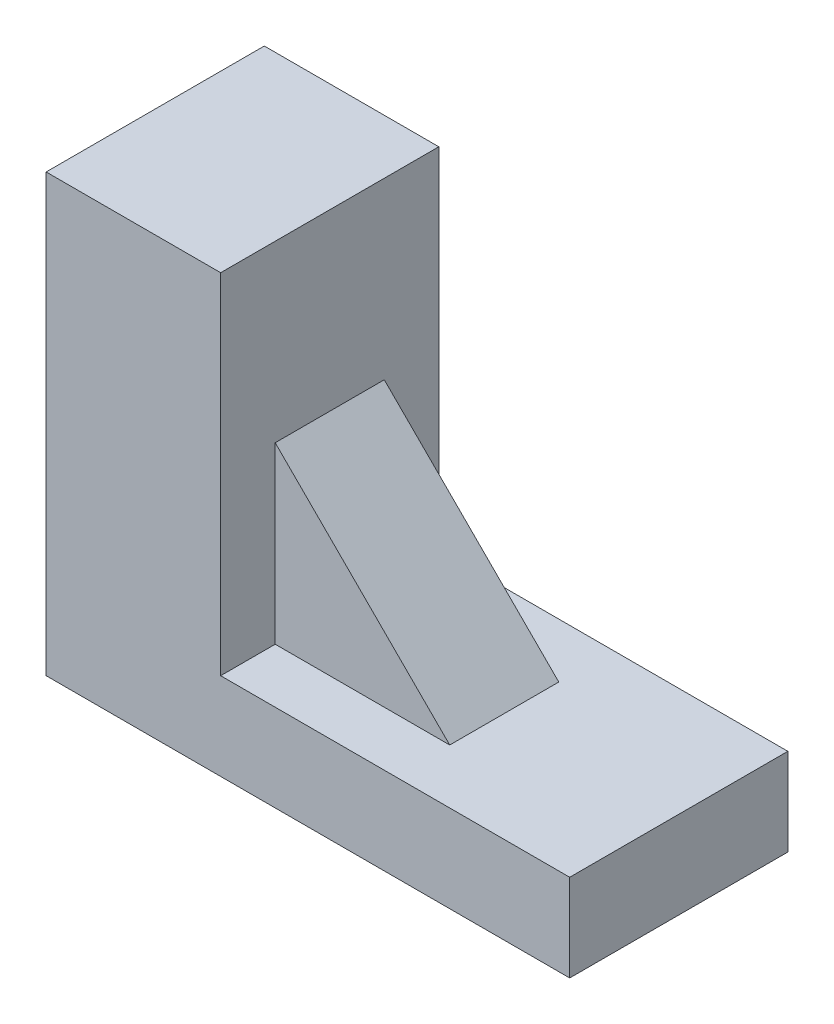
ISO-10303-21;
HEADER;
FILE_DESCRIPTION(('STEP AP214'),'2;1');
FILE_NAME('part.step','',(''),(''),'','','');
FILE_SCHEMA(('AUTOMOTIVE_DESIGN { 1 0 10303 214 1 1 1 1 }'));
ENDSEC;
DATA;
#1=APPLICATION_CONTEXT('core data for automotive mechanical design processes');
#2=APPLICATION_PROTOCOL_DEFINITION('international standard','automotive_design',2000,#1);
#3=PRODUCT_CONTEXT('',#1,'mechanical');
#4=PRODUCT('Part','Part','',(#3));
#5=PRODUCT_RELATED_PRODUCT_CATEGORY('part','',(#4));
#6=PRODUCT_DEFINITION_FORMATION('','',#4);
#7=PRODUCT_DEFINITION_CONTEXT('part definition',#1,'design');
#8=PRODUCT_DEFINITION('design','',#6,#7);
#9=PRODUCT_DEFINITION_SHAPE('','',#8);
#10=(LENGTH_UNIT() NAMED_UNIT(*) SI_UNIT(.MILLI.,.METRE.));
#11=(NAMED_UNIT(*) PLANE_ANGLE_UNIT() SI_UNIT($,.RADIAN.));
#12=(NAMED_UNIT(*) SI_UNIT($,.STERADIAN.) SOLID_ANGLE_UNIT());
#13=UNCERTAINTY_MEASURE_WITH_UNIT(LENGTH_MEASURE(1.E-05),#10,'distance_accuracy_value','');
#14=(GEOMETRIC_REPRESENTATION_CONTEXT(3) GLOBAL_UNCERTAINTY_ASSIGNED_CONTEXT((#13)) GLOBAL_UNIT_ASSIGNED_CONTEXT((#10,
#11,#12)) REPRESENTATION_CONTEXT('',''));
#15=CARTESIAN_POINT('',(0.,0.,0.));
#16=DIRECTION('',(0.,0.,1.));
#17=DIRECTION('',(1.,0.,0.));
#18=AXIS2_PLACEMENT_3D('',#15,#16,#17);
#19=CARTESIAN_POINT('',(8.,0.,-10.));
#20=DIRECTION('',(0.,1.,0.));
#21=DIRECTION('',(-1.,0.,0.));
#22=AXIS2_PLACEMENT_3D('',#19,#20,#21);
#23=PLANE('',#22);
#24=DIRECTION('',(-1.,0.,0.));
#25=VECTOR('',#24,1.);
#26=CARTESIAN_POINT('',(8.,0.,0.));
#27=LINE('',#26,#25);
#28=CARTESIAN_POINT('',(8.,0.,0.));
#29=VERTEX_POINT('',#28);
#30=CARTESIAN_POINT('',(0.,0.,0.));
#31=VERTEX_POINT('',#30);
#32=EDGE_CURVE('E149',#29,#31,#27,.T.);
#33=ORIENTED_EDGE('',*,*,#32,.F.);
#34=DIRECTION('',(0.,0.,1.));
#35=VECTOR('',#34,1.);
#36=CARTESIAN_POINT('',(8.,0.,-10.));
#37=LINE('',#36,#35);
#38=CARTESIAN_POINT('',(8.,0.,-10.));
#39=VERTEX_POINT('',#38);
#40=EDGE_CURVE('E11',#39,#29,#37,.T.);
#41=ORIENTED_EDGE('',*,*,#40,.F.);
#42=DIRECTION('',(-1.,0.,0.));
#43=VECTOR('',#42,1.);
#44=CARTESIAN_POINT('',(8.,0.,-10.));
#45=LINE('',#44,#43);
#46=CARTESIAN_POINT('',(0.,0.,-10.));
#47=VERTEX_POINT('',#46);
#48=EDGE_CURVE('E170',#39,#47,#45,.T.);
#49=ORIENTED_EDGE('',*,*,#48,.T.);
#50=DIRECTION('',(0.,0.,1.));
#51=VECTOR('',#50,1.);
#52=CARTESIAN_POINT('',(0.,0.,-10.));
#53=LINE('',#52,#51);
#54=EDGE_CURVE('E46',#47,#31,#53,.T.);
#55=ORIENTED_EDGE('',*,*,#54,.T.);
#56=EDGE_LOOP('',(#33,#41,#49,#55));
#57=FACE_BOUND('',#56,.T.);
#58=ADVANCED_FACE('F43',(#57),#23,.T.);
#59=CARTESIAN_POINT('',(8.,-16.,-10.));
#60=DIRECTION('',(1.,0.,0.));
#61=DIRECTION('',(0.,0.,-1.));
#62=AXIS2_PLACEMENT_3D('',#59,#60,#61);
#63=PLANE('',#62);
#64=DIRECTION('',(0.,-1.,0.));
#65=VECTOR('',#64,1.);
#66=CARTESIAN_POINT('',(8.,-16.,-2.5));
#67=LINE('',#66,#65);
#68=CARTESIAN_POINT('',(8.,-8.,-2.5));
#69=VERTEX_POINT('',#68);
#70=CARTESIAN_POINT('',(8.,-16.,-2.5));
#71=VERTEX_POINT('',#70);
#72=EDGE_CURVE('E188',#69,#71,#67,.T.);
#73=ORIENTED_EDGE('',*,*,#72,.F.);
#74=DIRECTION('',(0.,0.,-1.));
#75=VECTOR('',#74,1.);
#76=CARTESIAN_POINT('',(8.,-8.,-10.));
#77=LINE('',#76,#75);
#78=CARTESIAN_POINT('',(8.,-8.,-7.5));
#79=VERTEX_POINT('',#78);
#80=EDGE_CURVE('E154',#79,#69,#77,.F.);
#81=ORIENTED_EDGE('',*,*,#80,.F.);
#82=DIRECTION('',(0.,-1.,0.));
#83=VECTOR('',#82,1.);
#84=CARTESIAN_POINT('',(8.,-16.,-7.5));
#85=LINE('',#84,#83);
#86=CARTESIAN_POINT('',(8.,-16.,-7.5));
#87=VERTEX_POINT('',#86);
#88=EDGE_CURVE('E200',#79,#87,#85,.T.);
#89=ORIENTED_EDGE('',*,*,#88,.T.);
#90=DIRECTION('',(0.,0.,1.));
#91=VECTOR('',#90,1.);
#92=CARTESIAN_POINT('',(8.,-16.,-10.));
#93=LINE('',#92,#91);
#94=CARTESIAN_POINT('',(8.,-16.,-10.));
#95=VERTEX_POINT('',#94);
#96=EDGE_CURVE('E52',#95,#87,#93,.T.);
#97=ORIENTED_EDGE('',*,*,#96,.F.);
#98=DIRECTION('',(0.,1.,0.));
#99=VECTOR('',#98,1.);
#100=CARTESIAN_POINT('',(8.,-16.,-10.));
#101=LINE('',#100,#99);
#102=EDGE_CURVE('E135',#95,#39,#101,.T.);
#103=ORIENTED_EDGE('',*,*,#102,.T.);
#104=ORIENTED_EDGE('',*,*,#40,.T.);
#105=DIRECTION('',(0.,1.,0.));
#106=VECTOR('',#105,1.);
#107=CARTESIAN_POINT('',(8.,-16.,0.));
#108=LINE('',#107,#106);
#109=CARTESIAN_POINT('',(8.,-16.,0.));
#110=VERTEX_POINT('',#109);
#111=EDGE_CURVE('E167',#110,#29,#108,.T.);
#112=ORIENTED_EDGE('',*,*,#111,.F.);
#113=EDGE_CURVE('E126',#71,#110,#93,.T.);
#114=ORIENTED_EDGE('',*,*,#113,.F.);
#115=EDGE_LOOP('',(#73,#81,#89,#97,#103,#104,#112,#114));
#116=FACE_BOUND('',#115,.T.);
#117=ADVANCED_FACE('F184',(#116),#63,.T.);
#118=CARTESIAN_POINT('',(24.,-16.,-10.));
#119=DIRECTION('',(0.,1.,0.));
#120=DIRECTION('',(-1.,0.,0.));
#121=AXIS2_PLACEMENT_3D('',#118,#119,#120);
#122=PLANE('',#121);
#123=DIRECTION('',(1.,0.,0.));
#124=VECTOR('',#123,1.);
#125=CARTESIAN_POINT('',(24.,-16.,-2.5));
#126=LINE('',#125,#124);
#127=CARTESIAN_POINT('',(16.,-16.,-2.5));
#128=VERTEX_POINT('',#127);
#129=EDGE_CURVE('E193',#71,#128,#126,.T.);
#130=ORIENTED_EDGE('',*,*,#129,.F.);
#131=ORIENTED_EDGE('',*,*,#113,.T.);
#132=DIRECTION('',(-1.,0.,0.));
#133=VECTOR('',#132,1.);
#134=CARTESIAN_POINT('',(24.,-16.,0.));
#135=LINE('',#134,#133);
#136=CARTESIAN_POINT('',(24.,-16.,0.));
#137=VERTEX_POINT('',#136);
#138=EDGE_CURVE('E120',#137,#110,#135,.T.);
#139=ORIENTED_EDGE('',*,*,#138,.F.);
#140=DIRECTION('',(0.,0.,1.));
#141=VECTOR('',#140,1.);
#142=CARTESIAN_POINT('',(24.,-16.,-10.));
#143=LINE('',#142,#141);
#144=CARTESIAN_POINT('',(24.,-16.,-10.));
#145=VERTEX_POINT('',#144);
#146=EDGE_CURVE('E112',#145,#137,#143,.T.);
#147=ORIENTED_EDGE('',*,*,#146,.F.);
#148=DIRECTION('',(-1.,0.,0.));
#149=VECTOR('',#148,1.);
#150=CARTESIAN_POINT('',(24.,-16.,-10.));
#151=LINE('',#150,#149);
#152=EDGE_CURVE('E117',#145,#95,#151,.T.);
#153=ORIENTED_EDGE('',*,*,#152,.T.);
#154=ORIENTED_EDGE('',*,*,#96,.T.);
#155=DIRECTION('',(1.,0.,0.));
#156=VECTOR('',#155,1.);
#157=CARTESIAN_POINT('',(24.,-16.,-7.5));
#158=LINE('',#157,#156);
#159=CARTESIAN_POINT('',(16.,-16.,-7.5));
#160=VERTEX_POINT('',#159);
#161=EDGE_CURVE('E206',#87,#160,#158,.T.);
#162=ORIENTED_EDGE('',*,*,#161,.T.);
#163=DIRECTION('',(0.,0.,1.));
#164=VECTOR('',#163,1.);
#165=CARTESIAN_POINT('',(16.,-16.,-10.));
#166=LINE('',#165,#164);
#167=EDGE_CURVE('E195',#128,#160,#166,.F.);
#168=ORIENTED_EDGE('',*,*,#167,.F.);
#169=EDGE_LOOP('',(#130,#131,#139,#147,#153,#154,#162,#168));
#170=FACE_BOUND('',#169,.T.);
#171=ADVANCED_FACE('F115',(#170),#122,.T.);
#172=CARTESIAN_POINT('',(24.,-20.,-10.));
#173=DIRECTION('',(1.,0.,0.));
#174=DIRECTION('',(0.,1.,0.));
#175=AXIS2_PLACEMENT_3D('',#172,#173,#174);
#176=PLANE('',#175);
#177=DIRECTION('',(0.,1.,0.));
#178=VECTOR('',#177,1.);
#179=CARTESIAN_POINT('',(24.,-20.,0.));
#180=LINE('',#179,#178);
#181=CARTESIAN_POINT('',(24.,-20.,0.));
#182=VERTEX_POINT('',#181);
#183=EDGE_CURVE('E162',#182,#137,#180,.T.);
#184=ORIENTED_EDGE('',*,*,#183,.F.);
#185=DIRECTION('',(0.,0.,1.));
#186=VECTOR('',#185,1.);
#187=CARTESIAN_POINT('',(24.,-20.,-10.));
#188=LINE('',#187,#186);
#189=CARTESIAN_POINT('',(24.,-20.,-10.));
#190=VERTEX_POINT('',#189);
#191=EDGE_CURVE('E127',#190,#182,#188,.T.);
#192=ORIENTED_EDGE('',*,*,#191,.F.);
#193=DIRECTION('',(0.,1.,0.));
#194=VECTOR('',#193,1.);
#195=CARTESIAN_POINT('',(24.,-20.,-10.));
#196=LINE('',#195,#194);
#197=EDGE_CURVE('E133',#190,#145,#196,.T.);
#198=ORIENTED_EDGE('',*,*,#197,.T.);
#199=ORIENTED_EDGE('',*,*,#146,.T.);
#200=EDGE_LOOP('',(#184,#192,#198,#199));
#201=FACE_BOUND('',#200,.T.);
#202=ADVANCED_FACE('F138',(#201),#176,.T.);
#203=CARTESIAN_POINT('',(0.,-20.,-10.));
#204=DIRECTION('',(0.,-1.,0.));
#205=DIRECTION('',(0.,0.,-1.));
#206=AXIS2_PLACEMENT_3D('',#203,#204,#205);
#207=PLANE('',#206);
#208=DIRECTION('',(1.,0.,0.));
#209=VECTOR('',#208,1.);
#210=CARTESIAN_POINT('',(0.,-20.,0.));
#211=LINE('',#210,#209);
#212=CARTESIAN_POINT('',(0.,-20.,0.));
#213=VERTEX_POINT('',#212);
#214=EDGE_CURVE('E158',#213,#182,#211,.T.);
#215=ORIENTED_EDGE('',*,*,#214,.F.);
#216=DIRECTION('',(0.,0.,1.));
#217=VECTOR('',#216,1.);
#218=CARTESIAN_POINT('',(0.,-20.,-10.));
#219=LINE('',#218,#217);
#220=CARTESIAN_POINT('',(0.,-20.,-10.));
#221=VERTEX_POINT('',#220);
#222=EDGE_CURVE('E175',#221,#213,#219,.T.);
#223=ORIENTED_EDGE('',*,*,#222,.F.);
#224=DIRECTION('',(1.,0.,0.));
#225=VECTOR('',#224,1.);
#226=CARTESIAN_POINT('',(0.,-20.,-10.));
#227=LINE('',#226,#225);
#228=EDGE_CURVE('E140',#221,#190,#227,.T.);
#229=ORIENTED_EDGE('',*,*,#228,.T.);
#230=ORIENTED_EDGE('',*,*,#191,.T.);
#231=EDGE_LOOP('',(#215,#223,#229,#230));
#232=FACE_BOUND('',#231,.T.);
#233=ADVANCED_FACE('F218',(#232),#207,.T.);
#234=CARTESIAN_POINT('',(0.,0.,-10.));
#235=DIRECTION('',(-1.,0.,0.));
#236=DIRECTION('',(0.,-1.,0.));
#237=AXIS2_PLACEMENT_3D('',#234,#235,#236);
#238=PLANE('',#237);
#239=DIRECTION('',(0.,-1.,0.));
#240=VECTOR('',#239,1.);
#241=CARTESIAN_POINT('',(0.,0.,0.));
#242=LINE('',#241,#240);
#243=EDGE_CURVE('E153',#31,#213,#242,.T.);
#244=ORIENTED_EDGE('',*,*,#243,.F.);
#245=ORIENTED_EDGE('',*,*,#54,.F.);
#246=DIRECTION('',(0.,-1.,0.));
#247=VECTOR('',#246,1.);
#248=CARTESIAN_POINT('',(0.,0.,-10.));
#249=LINE('',#248,#247);
#250=EDGE_CURVE('E143',#47,#221,#249,.T.);
#251=ORIENTED_EDGE('',*,*,#250,.T.);
#252=ORIENTED_EDGE('',*,*,#222,.T.);
#253=EDGE_LOOP('',(#244,#245,#251,#252));
#254=FACE_BOUND('',#253,.T.);
#255=ADVANCED_FACE('F179',(#254),#238,.T.);
#256=CARTESIAN_POINT('',(0.,0.,-10.));
#257=DIRECTION('',(0.,0.,1.));
#258=DIRECTION('',(1.,0.,0.));
#259=AXIS2_PLACEMENT_3D('',#256,#257,#258);
#260=PLANE('',#259);
#261=ORIENTED_EDGE('',*,*,#48,.F.);
#262=ORIENTED_EDGE('',*,*,#102,.F.);
#263=ORIENTED_EDGE('',*,*,#152,.F.);
#264=ORIENTED_EDGE('',*,*,#197,.F.);
#265=ORIENTED_EDGE('',*,*,#228,.F.);
#266=ORIENTED_EDGE('',*,*,#250,.F.);
#267=EDGE_LOOP('',(#261,#262,#263,#264,#265,#266));
#268=FACE_BOUND('',#267,.T.);
#269=ADVANCED_FACE('F131',(#268),#260,.F.);
#270=CARTESIAN_POINT('',(0.,0.,0.));
#271=DIRECTION('',(0.,0.,1.));
#272=DIRECTION('',(1.,0.,0.));
#273=AXIS2_PLACEMENT_3D('',#270,#271,#272);
#274=PLANE('',#273);
#275=ORIENTED_EDGE('',*,*,#32,.T.);
#276=ORIENTED_EDGE('',*,*,#243,.T.);
#277=ORIENTED_EDGE('',*,*,#214,.T.);
#278=ORIENTED_EDGE('',*,*,#183,.T.);
#279=ORIENTED_EDGE('',*,*,#138,.T.);
#280=ORIENTED_EDGE('',*,*,#111,.T.);
#281=EDGE_LOOP('',(#275,#276,#277,#278,#279,#280));
#282=FACE_BOUND('',#281,.T.);
#283=ADVANCED_FACE('F181',(#282),#274,.T.);
#284=CARTESIAN_POINT('',(8.,-8.,-5.));
#285=DIRECTION('',(-0.707106781186547,-0.707106781186548,0.));
#286=DIRECTION('',(0.707106781186548,-0.707106781186548,0.));
#287=AXIS2_PLACEMENT_3D('',#284,#285,#286);
#288=PLANE('',#287);
#289=DIRECTION('',(0.707106781186548,-0.707106781186548,0.));
#290=VECTOR('',#289,1.);
#291=CARTESIAN_POINT('',(8.,-8.,-7.5));
#292=LINE('',#291,#290);
#293=EDGE_CURVE('E60',#79,#160,#292,.T.);
#294=ORIENTED_EDGE('',*,*,#293,.F.);
#295=ORIENTED_EDGE('',*,*,#80,.T.);
#296=DIRECTION('',(0.707106781186548,-0.707106781186548,0.));
#297=VECTOR('',#296,1.);
#298=CARTESIAN_POINT('',(8.,-8.,-2.5));
#299=LINE('',#298,#297);
#300=EDGE_CURVE('E251',#69,#128,#299,.T.);
#301=ORIENTED_EDGE('',*,*,#300,.T.);
#302=ORIENTED_EDGE('',*,*,#167,.T.);
#303=EDGE_LOOP('',(#294,#295,#301,#302));
#304=FACE_BOUND('',#303,.T.);
#305=ADVANCED_FACE('F238',(#304),#288,.F.);
#306=CARTESIAN_POINT('',(12.,-10.,-2.5));
#307=DIRECTION('',(0.,0.,1.));
#308=DIRECTION('',(1.,0.,0.));
#309=AXIS2_PLACEMENT_3D('',#306,#307,#308);
#310=PLANE('',#309);
#311=ORIENTED_EDGE('',*,*,#300,.F.);
#312=ORIENTED_EDGE('',*,*,#72,.T.);
#313=ORIENTED_EDGE('',*,*,#129,.T.);
#314=EDGE_LOOP('',(#311,#312,#313));
#315=FACE_BOUND('',#314,.T.);
#316=ADVANCED_FACE('F243',(#315),#310,.T.);
#317=CARTESIAN_POINT('',(12.,-10.,-7.5));
#318=DIRECTION('',(0.,0.,1.));
#319=DIRECTION('',(1.,0.,0.));
#320=AXIS2_PLACEMENT_3D('',#317,#318,#319);
#321=PLANE('',#320);
#322=ORIENTED_EDGE('',*,*,#88,.F.);
#323=ORIENTED_EDGE('',*,*,#293,.T.);
#324=ORIENTED_EDGE('',*,*,#161,.F.);
#325=EDGE_LOOP('',(#322,#323,#324));
#326=FACE_BOUND('',#325,.T.);
#327=ADVANCED_FACE('F245',(#326),#321,.F.);
#328=CLOSED_SHELL('',(#58,#117,#171,#202,#233,#255,#269,#283,#305,#316,#327));
#329=MANIFOLD_SOLID_BREP('B2',#328);
#330=ADVANCED_BREP_SHAPE_REPRESENTATION('',(#18,#329),#14);
#331=SHAPE_DEFINITION_REPRESENTATION(#9,#330);
ENDSEC;
END-ISO-10303-21;
